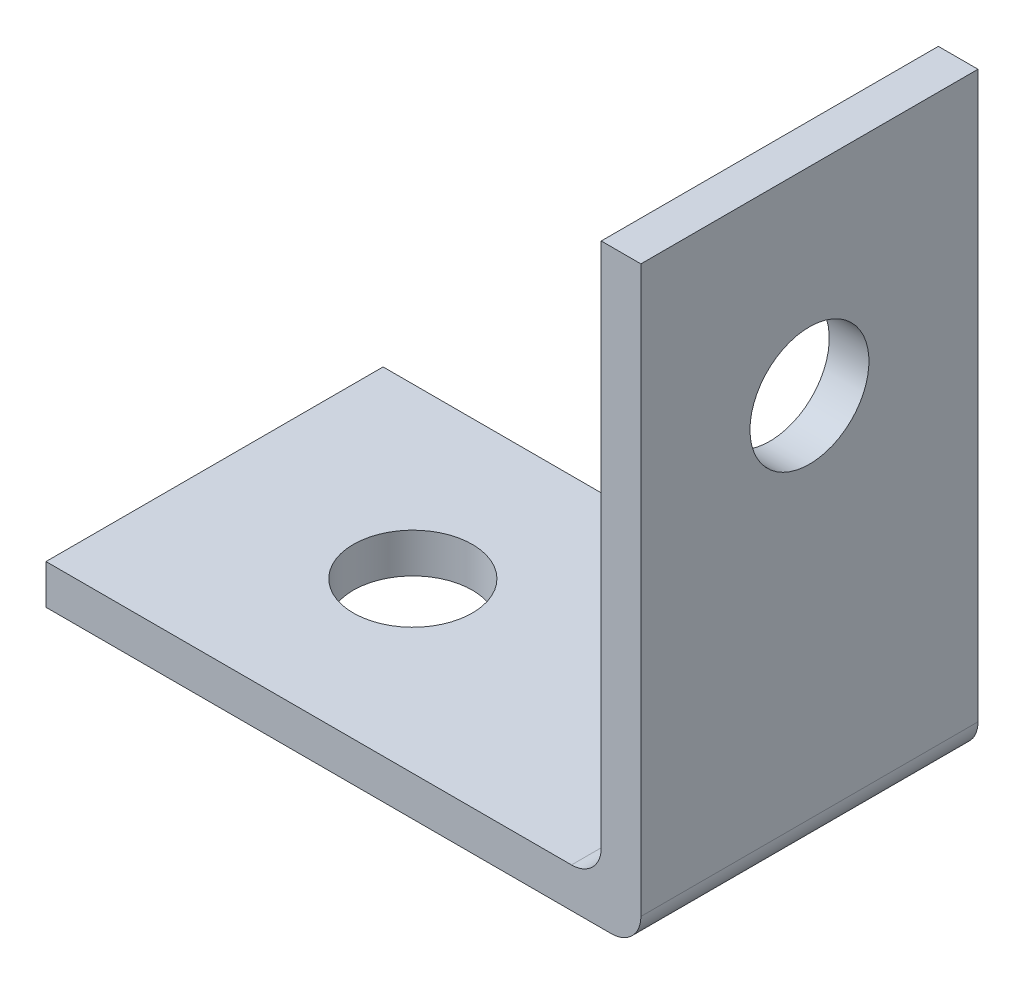
ISO-10303-21;
HEADER;
FILE_DESCRIPTION(('STEP AP214'),'2;1');
FILE_NAME('part.step','',(''),(''),'','','');
FILE_SCHEMA(('AUTOMOTIVE_DESIGN { 1 0 10303 214 1 1 1 1 }'));
ENDSEC;
DATA;
#1=APPLICATION_CONTEXT('core data for automotive mechanical design processes');
#2=APPLICATION_PROTOCOL_DEFINITION('international standard','automotive_design',2000,#1);
#3=PRODUCT_CONTEXT('',#1,'mechanical');
#4=PRODUCT('Part','Part','',(#3));
#5=PRODUCT_RELATED_PRODUCT_CATEGORY('part','',(#4));
#6=PRODUCT_DEFINITION_FORMATION('','',#4);
#7=PRODUCT_DEFINITION_CONTEXT('part definition',#1,'design');
#8=PRODUCT_DEFINITION('design','',#6,#7);
#9=PRODUCT_DEFINITION_SHAPE('','',#8);
#10=(LENGTH_UNIT() NAMED_UNIT(*) SI_UNIT(.MILLI.,.METRE.));
#11=(NAMED_UNIT(*) PLANE_ANGLE_UNIT() SI_UNIT($,.RADIAN.));
#12=(NAMED_UNIT(*) SI_UNIT($,.STERADIAN.) SOLID_ANGLE_UNIT());
#13=UNCERTAINTY_MEASURE_WITH_UNIT(LENGTH_MEASURE(1.E-05),#10,'distance_accuracy_value','');
#14=(GEOMETRIC_REPRESENTATION_CONTEXT(3) GLOBAL_UNCERTAINTY_ASSIGNED_CONTEXT((#13)) GLOBAL_UNIT_ASSIGNED_CONTEXT((#10,
#11,#12)) REPRESENTATION_CONTEXT('',''));
#15=CARTESIAN_POINT('',(0.,0.,0.));
#16=DIRECTION('',(0.,0.,1.));
#17=DIRECTION('',(1.,0.,0.));
#18=AXIS2_PLACEMENT_3D('',#15,#16,#17);
#19=CARTESIAN_POINT('',(0.,2.,17.));
#20=DIRECTION('',(1.,0.,0.));
#21=DIRECTION('',(0.,1.,0.));
#22=AXIS2_PLACEMENT_3D('',#19,#20,#21);
#23=PLANE('',#22);
#24=DIRECTION('',(0.,-1.,0.));
#25=VECTOR('',#24,1.);
#26=CARTESIAN_POINT('',(0.,2.,0.));
#27=LINE('',#26,#25);
#28=CARTESIAN_POINT('',(0.,2.,0.));
#29=VERTEX_POINT('',#28);
#30=CARTESIAN_POINT('',(0.,0.,0.));
#31=VERTEX_POINT('',#30);
#32=EDGE_CURVE('E131',#29,#31,#27,.T.);
#33=ORIENTED_EDGE('',*,*,#32,.T.);
#34=DIRECTION('',(0.,0.,-1.));
#35=VECTOR('',#34,1.);
#36=CARTESIAN_POINT('',(0.,0.,17.));
#37=LINE('',#36,#35);
#38=CARTESIAN_POINT('',(0.,0.,17.));
#39=VERTEX_POINT('',#38);
#40=EDGE_CURVE('E11',#39,#31,#37,.T.);
#41=ORIENTED_EDGE('',*,*,#40,.F.);
#42=DIRECTION('',(0.,-1.,0.));
#43=VECTOR('',#42,1.);
#44=CARTESIAN_POINT('',(0.,2.,17.));
#45=LINE('',#44,#43);
#46=CARTESIAN_POINT('',(0.,2.,17.));
#47=VERTEX_POINT('',#46);
#48=EDGE_CURVE('E146',#47,#39,#45,.T.);
#49=ORIENTED_EDGE('',*,*,#48,.F.);
#50=DIRECTION('',(0.,0.,-1.));
#51=VECTOR('',#50,1.);
#52=CARTESIAN_POINT('',(0.,2.,17.));
#53=LINE('',#52,#51);
#54=EDGE_CURVE('E127',#47,#29,#53,.T.);
#55=ORIENTED_EDGE('',*,*,#54,.T.);
#56=EDGE_LOOP('',(#33,#41,#49,#55));
#57=FACE_BOUND('',#56,.T.);
#58=ADVANCED_FACE('F35',(#57),#23,.F.);
#59=CARTESIAN_POINT('',(0.,0.,17.));
#60=DIRECTION('',(0.,1.,0.));
#61=DIRECTION('',(0.,0.,1.));
#62=AXIS2_PLACEMENT_3D('',#59,#60,#61);
#63=PLANE('',#62);
#64=CARTESIAN_POINT('',(10.,0.,8.5));
#65=DIRECTION('',(0.,1.,0.));
#66=DIRECTION('',(-1.,0.,0.));
#67=AXIS2_PLACEMENT_3D('',#64,#65,#66);
#68=CIRCLE('',#67,3.);
#69=CARTESIAN_POINT('',(7.,0.,8.5));
#70=VERTEX_POINT('',#69);
#71=EDGE_CURVE('E182',#70,#70,#68,.T.);
#72=ORIENTED_EDGE('',*,*,#71,.T.);
#73=EDGE_LOOP('',(#72));
#74=FACE_BOUND('',#73,.T.);
#75=DIRECTION('',(1.,0.,0.));
#76=VECTOR('',#75,1.);
#77=CARTESIAN_POINT('',(0.,0.,0.));
#78=LINE('',#77,#76);
#79=CARTESIAN_POINT('',(28.5,0.,0.));
#80=VERTEX_POINT('',#79);
#81=EDGE_CURVE('E134',#31,#80,#78,.T.);
#82=ORIENTED_EDGE('',*,*,#81,.T.);
#83=DIRECTION('',(0.,0.,-1.));
#84=VECTOR('',#83,1.);
#85=CARTESIAN_POINT('',(28.5,0.,17.));
#86=LINE('',#85,#84);
#87=CARTESIAN_POINT('',(28.5,0.,17.));
#88=VERTEX_POINT('',#87);
#89=EDGE_CURVE('E43',#88,#80,#86,.T.);
#90=ORIENTED_EDGE('',*,*,#89,.F.);
#91=DIRECTION('',(1.,0.,0.));
#92=VECTOR('',#91,1.);
#93=CARTESIAN_POINT('',(0.,0.,17.));
#94=LINE('',#93,#92);
#95=EDGE_CURVE('E94',#39,#88,#94,.T.);
#96=ORIENTED_EDGE('',*,*,#95,.F.);
#97=ORIENTED_EDGE('',*,*,#40,.T.);
#98=EDGE_LOOP('',(#82,#90,#96,#97));
#99=FACE_BOUND('',#98,.T.);
#100=ADVANCED_FACE('F191',(#74,#99),#63,.F.);
#101=CARTESIAN_POINT('',(28.5,1.5,17.));
#102=DIRECTION('',(0.,0.,-1.));
#103=DIRECTION('',(-1.,0.,0.));
#104=AXIS2_PLACEMENT_3D('',#101,#102,#103);
#105=CYLINDRICAL_SURFACE('',#104,1.5);
#106=CARTESIAN_POINT('',(28.5,1.5,0.));
#107=DIRECTION('',(0.,0.,1.));
#108=DIRECTION('',(1.,0.,0.));
#109=AXIS2_PLACEMENT_3D('',#106,#107,#108);
#110=CIRCLE('',#109,1.5);
#111=CARTESIAN_POINT('',(30.,1.5,0.));
#112=VERTEX_POINT('',#111);
#113=EDGE_CURVE('E137',#80,#112,#110,.T.);
#114=ORIENTED_EDGE('',*,*,#113,.T.);
#115=DIRECTION('',(0.,0.,-1.));
#116=VECTOR('',#115,1.);
#117=CARTESIAN_POINT('',(30.,1.5,17.));
#118=LINE('',#117,#116);
#119=CARTESIAN_POINT('',(30.,1.5,17.));
#120=VERTEX_POINT('',#119);
#121=EDGE_CURVE('E153',#120,#112,#118,.T.);
#122=ORIENTED_EDGE('',*,*,#121,.F.);
#123=CARTESIAN_POINT('',(28.5,1.5,17.));
#124=DIRECTION('',(0.,0.,1.));
#125=DIRECTION('',(1.,0.,0.));
#126=AXIS2_PLACEMENT_3D('',#123,#124,#125);
#127=CIRCLE('',#126,1.5);
#128=EDGE_CURVE('E161',#88,#120,#127,.T.);
#129=ORIENTED_EDGE('',*,*,#128,.F.);
#130=ORIENTED_EDGE('',*,*,#89,.T.);
#131=EDGE_LOOP('',(#114,#122,#129,#130));
#132=FACE_BOUND('',#131,.T.);
#133=ADVANCED_FACE('F159',(#132),#105,.T.);
#134=CARTESIAN_POINT('',(30.,1.5,17.));
#135=DIRECTION('',(-1.,0.,0.));
#136=DIRECTION('',(0.,0.,1.));
#137=AXIS2_PLACEMENT_3D('',#134,#135,#136);
#138=PLANE('',#137);
#139=CARTESIAN_POINT('',(30.,20.,8.5));
#140=DIRECTION('',(-1.,0.,0.));
#141=DIRECTION('',(0.,0.,1.));
#142=AXIS2_PLACEMENT_3D('',#139,#140,#141);
#143=CIRCLE('',#142,3.);
#144=CARTESIAN_POINT('',(30.,20.,11.5));
#145=VERTEX_POINT('',#144);
#146=EDGE_CURVE('E135',#145,#145,#143,.T.);
#147=ORIENTED_EDGE('',*,*,#146,.T.);
#148=EDGE_LOOP('',(#147));
#149=FACE_BOUND('',#148,.T.);
#150=DIRECTION('',(0.,1.,0.));
#151=VECTOR('',#150,1.);
#152=CARTESIAN_POINT('',(30.,1.5,0.));
#153=LINE('',#152,#151);
#154=CARTESIAN_POINT('',(30.,30.,0.));
#155=VERTEX_POINT('',#154);
#156=EDGE_CURVE('E139',#112,#155,#153,.T.);
#157=ORIENTED_EDGE('',*,*,#156,.T.);
#158=DIRECTION('',(0.,0.,-1.));
#159=VECTOR('',#158,1.);
#160=CARTESIAN_POINT('',(30.,30.,17.));
#161=LINE('',#160,#159);
#162=CARTESIAN_POINT('',(30.,30.,17.));
#163=VERTEX_POINT('',#162);
#164=EDGE_CURVE('E150',#163,#155,#161,.T.);
#165=ORIENTED_EDGE('',*,*,#164,.F.);
#166=DIRECTION('',(0.,1.,0.));
#167=VECTOR('',#166,1.);
#168=CARTESIAN_POINT('',(30.,1.5,17.));
#169=LINE('',#168,#167);
#170=EDGE_CURVE('E173',#120,#163,#169,.T.);
#171=ORIENTED_EDGE('',*,*,#170,.F.);
#172=ORIENTED_EDGE('',*,*,#121,.T.);
#173=EDGE_LOOP('',(#157,#165,#171,#172));
#174=FACE_BOUND('',#173,.T.);
#175=ADVANCED_FACE('F169',(#149,#174),#138,.F.);
#176=CARTESIAN_POINT('',(30.,30.,17.));
#177=DIRECTION('',(0.,-1.,0.));
#178=DIRECTION('',(1.,0.,0.));
#179=AXIS2_PLACEMENT_3D('',#176,#177,#178);
#180=PLANE('',#179);
#181=DIRECTION('',(-1.,0.,0.));
#182=VECTOR('',#181,1.);
#183=CARTESIAN_POINT('',(30.,30.,0.));
#184=LINE('',#183,#182);
#185=CARTESIAN_POINT('',(28.,30.,0.));
#186=VERTEX_POINT('',#185);
#187=EDGE_CURVE('E141',#155,#186,#184,.T.);
#188=ORIENTED_EDGE('',*,*,#187,.T.);
#189=DIRECTION('',(0.,0.,-1.));
#190=VECTOR('',#189,1.);
#191=CARTESIAN_POINT('',(28.,30.,17.));
#192=LINE('',#191,#190);
#193=CARTESIAN_POINT('',(28.,30.,17.));
#194=VERTEX_POINT('',#193);
#195=EDGE_CURVE('E122',#194,#186,#192,.T.);
#196=ORIENTED_EDGE('',*,*,#195,.F.);
#197=DIRECTION('',(-1.,0.,0.));
#198=VECTOR('',#197,1.);
#199=CARTESIAN_POINT('',(30.,30.,17.));
#200=LINE('',#199,#198);
#201=EDGE_CURVE('E113',#163,#194,#200,.T.);
#202=ORIENTED_EDGE('',*,*,#201,.F.);
#203=ORIENTED_EDGE('',*,*,#164,.T.);
#204=EDGE_LOOP('',(#188,#196,#202,#203));
#205=FACE_BOUND('',#204,.T.);
#206=ADVANCED_FACE('F172',(#205),#180,.F.);
#207=CARTESIAN_POINT('',(28.,30.,17.));
#208=DIRECTION('',(1.,0.,0.));
#209=DIRECTION('',(0.,0.,-1.));
#210=AXIS2_PLACEMENT_3D('',#207,#208,#209);
#211=PLANE('',#210);
#212=CARTESIAN_POINT('',(28.,20.,8.5));
#213=DIRECTION('',(-1.,0.,0.));
#214=DIRECTION('',(0.,0.,1.));
#215=AXIS2_PLACEMENT_3D('',#212,#213,#214);
#216=CIRCLE('',#215,3.);
#217=CARTESIAN_POINT('',(28.,20.,11.5));
#218=VERTEX_POINT('',#217);
#219=EDGE_CURVE('E179',#218,#218,#216,.T.);
#220=ORIENTED_EDGE('',*,*,#219,.F.);
#221=EDGE_LOOP('',(#220));
#222=FACE_BOUND('',#221,.T.);
#223=DIRECTION('',(0.,-1.,0.));
#224=VECTOR('',#223,1.);
#225=CARTESIAN_POINT('',(28.,30.,0.));
#226=LINE('',#225,#224);
#227=CARTESIAN_POINT('',(28.,3.5,0.));
#228=VERTEX_POINT('',#227);
#229=EDGE_CURVE('E121',#186,#228,#226,.T.);
#230=ORIENTED_EDGE('',*,*,#229,.T.);
#231=DIRECTION('',(0.,0.,-1.));
#232=VECTOR('',#231,1.);
#233=CARTESIAN_POINT('',(28.,3.5,17.));
#234=LINE('',#233,#232);
#235=CARTESIAN_POINT('',(28.,3.5,17.));
#236=VERTEX_POINT('',#235);
#237=EDGE_CURVE('E118',#236,#228,#234,.T.);
#238=ORIENTED_EDGE('',*,*,#237,.F.);
#239=DIRECTION('',(0.,-1.,0.));
#240=VECTOR('',#239,1.);
#241=CARTESIAN_POINT('',(28.,30.,17.));
#242=LINE('',#241,#240);
#243=EDGE_CURVE('E107',#194,#236,#242,.T.);
#244=ORIENTED_EDGE('',*,*,#243,.F.);
#245=ORIENTED_EDGE('',*,*,#195,.T.);
#246=EDGE_LOOP('',(#230,#238,#244,#245));
#247=FACE_BOUND('',#246,.T.);
#248=ADVANCED_FACE('F119',(#222,#247),#211,.F.);
#249=CARTESIAN_POINT('',(26.5,3.5,17.));
#250=DIRECTION('',(0.,0.,-1.));
#251=DIRECTION('',(-1.,0.,0.));
#252=AXIS2_PLACEMENT_3D('',#249,#250,#251);
#253=CYLINDRICAL_SURFACE('',#252,1.5);
#254=CARTESIAN_POINT('',(26.5,3.5,0.));
#255=DIRECTION('',(0.,0.,-1.));
#256=DIRECTION('',(-1.,0.,0.));
#257=AXIS2_PLACEMENT_3D('',#254,#255,#256);
#258=CIRCLE('',#257,1.5);
#259=CARTESIAN_POINT('',(26.5,2.,0.));
#260=VERTEX_POINT('',#259);
#261=EDGE_CURVE('E80',#228,#260,#258,.T.);
#262=ORIENTED_EDGE('',*,*,#261,.T.);
#263=DIRECTION('',(0.,0.,-1.));
#264=VECTOR('',#263,1.);
#265=CARTESIAN_POINT('',(26.5,2.,17.));
#266=LINE('',#265,#264);
#267=CARTESIAN_POINT('',(26.5,2.,17.));
#268=VERTEX_POINT('',#267);
#269=EDGE_CURVE('E123',#268,#260,#266,.T.);
#270=ORIENTED_EDGE('',*,*,#269,.F.);
#271=CARTESIAN_POINT('',(26.5,3.5,17.));
#272=DIRECTION('',(0.,0.,-1.));
#273=DIRECTION('',(-1.,0.,0.));
#274=AXIS2_PLACEMENT_3D('',#271,#272,#273);
#275=CIRCLE('',#274,1.5);
#276=EDGE_CURVE('E111',#236,#268,#275,.T.);
#277=ORIENTED_EDGE('',*,*,#276,.F.);
#278=ORIENTED_EDGE('',*,*,#237,.T.);
#279=EDGE_LOOP('',(#262,#270,#277,#278));
#280=FACE_BOUND('',#279,.T.);
#281=ADVANCED_FACE('F125',(#280),#253,.F.);
#282=CARTESIAN_POINT('',(26.5,2.,17.));
#283=DIRECTION('',(0.,-1.,0.));
#284=DIRECTION('',(1.,0.,0.));
#285=AXIS2_PLACEMENT_3D('',#282,#283,#284);
#286=PLANE('',#285);
#287=CARTESIAN_POINT('',(10.,2.,8.5));
#288=DIRECTION('',(0.,1.,0.));
#289=DIRECTION('',(-1.,0.,0.));
#290=AXIS2_PLACEMENT_3D('',#287,#288,#289);
#291=CIRCLE('',#290,3.);
#292=CARTESIAN_POINT('',(7.,2.,8.5));
#293=VERTEX_POINT('',#292);
#294=EDGE_CURVE('E185',#293,#293,#291,.T.);
#295=ORIENTED_EDGE('',*,*,#294,.F.);
#296=EDGE_LOOP('',(#295));
#297=FACE_BOUND('',#296,.T.);
#298=DIRECTION('',(-1.,0.,0.));
#299=VECTOR('',#298,1.);
#300=CARTESIAN_POINT('',(26.5,2.,0.));
#301=LINE('',#300,#299);
#302=EDGE_CURVE('E86',#260,#29,#301,.T.);
#303=ORIENTED_EDGE('',*,*,#302,.T.);
#304=ORIENTED_EDGE('',*,*,#54,.F.);
#305=DIRECTION('',(-1.,0.,0.));
#306=VECTOR('',#305,1.);
#307=CARTESIAN_POINT('',(26.5,2.,17.));
#308=LINE('',#307,#306);
#309=EDGE_CURVE('E51',#268,#47,#308,.T.);
#310=ORIENTED_EDGE('',*,*,#309,.F.);
#311=ORIENTED_EDGE('',*,*,#269,.T.);
#312=EDGE_LOOP('',(#303,#304,#310,#311));
#313=FACE_BOUND('',#312,.T.);
#314=ADVANCED_FACE('F200',(#297,#313),#286,.F.);
#315=CARTESIAN_POINT('',(28.5,1.5,17.));
#316=DIRECTION('',(0.,0.,1.));
#317=DIRECTION('',(1.,0.,0.));
#318=AXIS2_PLACEMENT_3D('',#315,#316,#317);
#319=PLANE('',#318);
#320=ORIENTED_EDGE('',*,*,#48,.T.);
#321=ORIENTED_EDGE('',*,*,#95,.T.);
#322=ORIENTED_EDGE('',*,*,#128,.T.);
#323=ORIENTED_EDGE('',*,*,#170,.T.);
#324=ORIENTED_EDGE('',*,*,#201,.T.);
#325=ORIENTED_EDGE('',*,*,#243,.T.);
#326=ORIENTED_EDGE('',*,*,#276,.T.);
#327=ORIENTED_EDGE('',*,*,#309,.T.);
#328=EDGE_LOOP('',(#320,#321,#322,#323,#324,#325,#326,#327));
#329=FACE_BOUND('',#328,.T.);
#330=ADVANCED_FACE('F109',(#329),#319,.T.);
#331=CARTESIAN_POINT('',(28.5,1.5,0.));
#332=DIRECTION('',(0.,0.,1.));
#333=DIRECTION('',(1.,0.,0.));
#334=AXIS2_PLACEMENT_3D('',#331,#332,#333);
#335=PLANE('',#334);
#336=ORIENTED_EDGE('',*,*,#32,.F.);
#337=ORIENTED_EDGE('',*,*,#302,.F.);
#338=ORIENTED_EDGE('',*,*,#261,.F.);
#339=ORIENTED_EDGE('',*,*,#229,.F.);
#340=ORIENTED_EDGE('',*,*,#187,.F.);
#341=ORIENTED_EDGE('',*,*,#156,.F.);
#342=ORIENTED_EDGE('',*,*,#113,.F.);
#343=ORIENTED_EDGE('',*,*,#81,.F.);
#344=EDGE_LOOP('',(#336,#337,#338,#339,#340,#341,#342,#343));
#345=FACE_BOUND('',#344,.T.);
#346=ADVANCED_FACE('F165',(#345),#335,.F.);
#347=CARTESIAN_POINT('',(30.,20.,8.5));
#348=DIRECTION('',(-1.,0.,0.));
#349=DIRECTION('',(0.,0.,1.));
#350=AXIS2_PLACEMENT_3D('',#347,#348,#349);
#351=CYLINDRICAL_SURFACE('',#350,3.);
#352=ORIENTED_EDGE('',*,*,#146,.F.);
#353=EDGE_LOOP('',(#352));
#354=FACE_BOUND('',#353,.T.);
#355=ORIENTED_EDGE('',*,*,#219,.T.);
#356=EDGE_LOOP('',(#355));
#357=FACE_BOUND('',#356,.T.);
#358=ADVANCED_FACE('F196',(#354,#357),#351,.F.);
#359=CARTESIAN_POINT('',(10.,0.,8.5));
#360=DIRECTION('',(0.,1.,0.));
#361=DIRECTION('',(-1.,0.,0.));
#362=AXIS2_PLACEMENT_3D('',#359,#360,#361);
#363=CYLINDRICAL_SURFACE('',#362,3.);
#364=ORIENTED_EDGE('',*,*,#71,.F.);
#365=EDGE_LOOP('',(#364));
#366=FACE_BOUND('',#365,.T.);
#367=ORIENTED_EDGE('',*,*,#294,.T.);
#368=EDGE_LOOP('',(#367));
#369=FACE_BOUND('',#368,.T.);
#370=ADVANCED_FACE('F193',(#366,#369),#363,.F.);
#371=CLOSED_SHELL('',(#58,#100,#133,#175,#206,#248,#281,#314,#330,#346,#358,#370));
#372=MANIFOLD_SOLID_BREP('B2',#371);
#373=ADVANCED_BREP_SHAPE_REPRESENTATION('',(#18,#372),#14);
#374=SHAPE_DEFINITION_REPRESENTATION(#9,#373);
ENDSEC;
END-ISO-10303-21;
